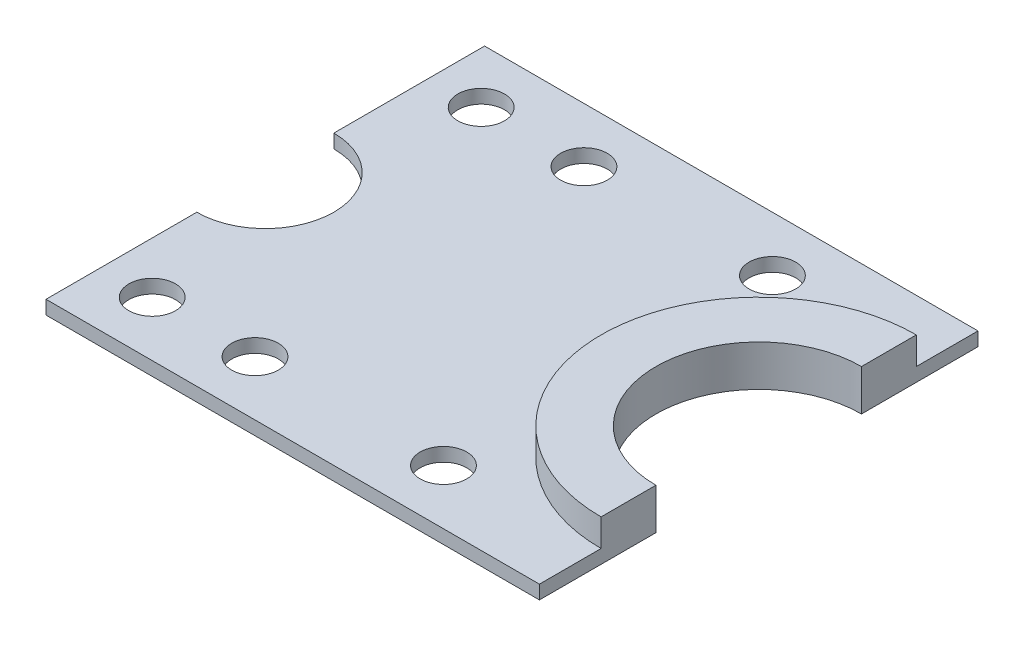
ISO-10303-21;
HEADER;
FILE_DESCRIPTION(('STEP AP214'),'2;1');
FILE_NAME('part.step','',(''),(''),'','','');
FILE_SCHEMA(('AUTOMOTIVE_DESIGN { 1 0 10303 214 1 1 1 1 }'));
ENDSEC;
DATA;
#1=APPLICATION_CONTEXT('core data for automotive mechanical design processes');
#2=APPLICATION_PROTOCOL_DEFINITION('international standard','automotive_design',2000,#1);
#3=PRODUCT_CONTEXT('',#1,'mechanical');
#4=PRODUCT('Part','Part','',(#3));
#5=PRODUCT_RELATED_PRODUCT_CATEGORY('part','',(#4));
#6=PRODUCT_DEFINITION_FORMATION('','',#4);
#7=PRODUCT_DEFINITION_CONTEXT('part definition',#1,'design');
#8=PRODUCT_DEFINITION('design','',#6,#7);
#9=PRODUCT_DEFINITION_SHAPE('','',#8);
#10=(LENGTH_UNIT() NAMED_UNIT(*) SI_UNIT(.MILLI.,.METRE.));
#11=(NAMED_UNIT(*) PLANE_ANGLE_UNIT() SI_UNIT($,.RADIAN.));
#12=(NAMED_UNIT(*) SI_UNIT($,.STERADIAN.) SOLID_ANGLE_UNIT());
#13=UNCERTAINTY_MEASURE_WITH_UNIT(LENGTH_MEASURE(1.E-05),#10,'distance_accuracy_value','');
#14=(GEOMETRIC_REPRESENTATION_CONTEXT(3) GLOBAL_UNCERTAINTY_ASSIGNED_CONTEXT((#13)) GLOBAL_UNIT_ASSIGNED_CONTEXT((#10,
#11,#12)) REPRESENTATION_CONTEXT('',''));
#15=CARTESIAN_POINT('',(0.,0.,0.));
#16=DIRECTION('',(0.,0.,1.));
#17=DIRECTION('',(1.,0.,0.));
#18=AXIS2_PLACEMENT_3D('',#15,#16,#17);
#19=CARTESIAN_POINT('',(0.,1.,0.));
#20=DIRECTION('',(1.,0.,0.));
#21=DIRECTION('',(0.,0.,-1.));
#22=AXIS2_PLACEMENT_3D('',#19,#20,#21);
#23=PLANE('',#22);
#24=DIRECTION('',(0.,0.,1.));
#25=VECTOR('',#24,1.);
#26=CARTESIAN_POINT('',(0.,0.,0.));
#27=LINE('',#26,#25);
#28=CARTESIAN_POINT('',(0.,0.,-32.));
#29=VERTEX_POINT('',#28);
#30=CARTESIAN_POINT('',(0.,0.,-21.));
#31=VERTEX_POINT('',#30);
#32=EDGE_CURVE('E207',#29,#31,#27,.T.);
#33=ORIENTED_EDGE('',*,*,#32,.T.);
#34=DIRECTION('',(0.,1.,0.));
#35=VECTOR('',#34,1.);
#36=CARTESIAN_POINT('',(0.,-21.2132034355964,-21.));
#37=LINE('',#36,#35);
#38=CARTESIAN_POINT('',(0.,1.,-21.));
#39=VERTEX_POINT('',#38);
#40=EDGE_CURVE('E125',#31,#39,#37,.T.);
#41=ORIENTED_EDGE('',*,*,#40,.T.);
#42=DIRECTION('',(0.,0.,1.));
#43=VECTOR('',#42,1.);
#44=CARTESIAN_POINT('',(0.,1.,0.));
#45=LINE('',#44,#43);
#46=CARTESIAN_POINT('',(0.,1.,-32.));
#47=VERTEX_POINT('',#46);
#48=EDGE_CURVE('E195',#47,#39,#45,.T.);
#49=ORIENTED_EDGE('',*,*,#48,.F.);
#50=DIRECTION('',(0.,-1.,0.));
#51=VECTOR('',#50,1.);
#52=CARTESIAN_POINT('',(0.,1.,-32.));
#53=LINE('',#52,#51);
#54=EDGE_CURVE('E206',#47,#29,#53,.T.);
#55=ORIENTED_EDGE('',*,*,#54,.T.);
#56=EDGE_LOOP('',(#33,#41,#49,#55));
#57=FACE_BOUND('',#56,.T.);
#58=ADVANCED_FACE('F43',(#57),#23,.F.);
#59=CARTESIAN_POINT('',(36.,1.,0.));
#60=DIRECTION('',(-1.,0.,0.));
#61=DIRECTION('',(0.,0.,1.));
#62=AXIS2_PLACEMENT_3D('',#59,#60,#61);
#63=PLANE('',#62);
#64=DIRECTION('',(0.,0.,-1.));
#65=VECTOR('',#64,1.);
#66=CARTESIAN_POINT('',(36.,0.,0.));
#67=LINE('',#66,#65);
#68=CARTESIAN_POINT('',(36.,0.,0.));
#69=VERTEX_POINT('',#68);
#70=CARTESIAN_POINT('',(36.,0.,-8.5));
#71=VERTEX_POINT('',#70);
#72=EDGE_CURVE('E213',#69,#71,#67,.T.);
#73=ORIENTED_EDGE('',*,*,#72,.T.);
#74=DIRECTION('',(0.,1.,0.));
#75=VECTOR('',#74,1.);
#76=CARTESIAN_POINT('',(36.,-21.2132034355964,-8.5));
#77=LINE('',#76,#75);
#78=CARTESIAN_POINT('',(36.,3.,-8.5));
#79=VERTEX_POINT('',#78);
#80=EDGE_CURVE('E66',#71,#79,#77,.T.);
#81=ORIENTED_EDGE('',*,*,#80,.T.);
#82=DIRECTION('',(0.,0.,-1.));
#83=VECTOR('',#82,1.);
#84=CARTESIAN_POINT('',(36.,3.,-8.5));
#85=LINE('',#84,#83);
#86=CARTESIAN_POINT('',(36.,3.,-4.5));
#87=VERTEX_POINT('',#86);
#88=EDGE_CURVE('E139',#87,#79,#85,.T.);
#89=ORIENTED_EDGE('',*,*,#88,.F.);
#90=DIRECTION('',(0.,-1.,0.));
#91=VECTOR('',#90,1.);
#92=CARTESIAN_POINT('',(36.,3.,-4.5));
#93=LINE('',#92,#91);
#94=CARTESIAN_POINT('',(36.,1.,-4.5));
#95=VERTEX_POINT('',#94);
#96=EDGE_CURVE('E144',#87,#95,#93,.T.);
#97=ORIENTED_EDGE('',*,*,#96,.T.);
#98=DIRECTION('',(0.,0.,-1.));
#99=VECTOR('',#98,1.);
#100=CARTESIAN_POINT('',(36.,1.,0.));
#101=LINE('',#100,#99);
#102=CARTESIAN_POINT('',(36.,1.,0.));
#103=VERTEX_POINT('',#102);
#104=EDGE_CURVE('E202',#103,#95,#101,.T.);
#105=ORIENTED_EDGE('',*,*,#104,.F.);
#106=DIRECTION('',(0.,-1.,0.));
#107=VECTOR('',#106,1.);
#108=CARTESIAN_POINT('',(36.,1.,0.));
#109=LINE('',#108,#107);
#110=EDGE_CURVE('E223',#103,#69,#109,.T.);
#111=ORIENTED_EDGE('',*,*,#110,.T.);
#112=EDGE_LOOP('',(#73,#81,#89,#97,#105,#111));
#113=FACE_BOUND('',#112,.T.);
#114=ADVANCED_FACE('F241',(#113),#63,.F.);
#115=CARTESIAN_POINT('',(0.,1.,-11.));
#116=VERTEX_POINT('',#115);
#117=CARTESIAN_POINT('',(0.,1.,0.));
#118=VERTEX_POINT('',#117);
#119=EDGE_CURVE('E199',#116,#118,#45,.T.);
#120=ORIENTED_EDGE('',*,*,#119,.F.);
#121=DIRECTION('',(0.,1.,0.));
#122=VECTOR('',#121,1.);
#123=CARTESIAN_POINT('',(0.,-21.2132034355964,-11.));
#124=LINE('',#123,#122);
#125=CARTESIAN_POINT('',(0.,0.,-11.));
#126=VERTEX_POINT('',#125);
#127=EDGE_CURVE('E188',#116,#126,#124,.F.);
#128=ORIENTED_EDGE('',*,*,#127,.T.);
#129=CARTESIAN_POINT('',(0.,0.,0.));
#130=VERTEX_POINT('',#129);
#131=EDGE_CURVE('E194',#126,#130,#27,.T.);
#132=ORIENTED_EDGE('',*,*,#131,.T.);
#133=DIRECTION('',(0.,-1.,0.));
#134=VECTOR('',#133,1.);
#135=CARTESIAN_POINT('',(0.,1.,0.));
#136=LINE('',#135,#134);
#137=EDGE_CURVE('E51',#118,#130,#136,.T.);
#138=ORIENTED_EDGE('',*,*,#137,.F.);
#139=EDGE_LOOP('',(#120,#128,#132,#138));
#140=FACE_BOUND('',#139,.T.);
#141=ADVANCED_FACE('F45',(#140),#23,.F.);
#142=CARTESIAN_POINT('',(0.,1.,0.));
#143=DIRECTION('',(0.,0.,-1.));
#144=DIRECTION('',(-1.,0.,0.));
#145=AXIS2_PLACEMENT_3D('',#142,#143,#144);
#146=PLANE('',#145);
#147=DIRECTION('',(1.,0.,0.));
#148=VECTOR('',#147,1.);
#149=CARTESIAN_POINT('',(0.,0.,0.));
#150=LINE('',#149,#148);
#151=EDGE_CURVE('E210',#130,#69,#150,.T.);
#152=ORIENTED_EDGE('',*,*,#151,.T.);
#153=ORIENTED_EDGE('',*,*,#110,.F.);
#154=DIRECTION('',(1.,0.,0.));
#155=VECTOR('',#154,1.);
#156=CARTESIAN_POINT('',(0.,1.,0.));
#157=LINE('',#156,#155);
#158=EDGE_CURVE('E198',#118,#103,#157,.T.);
#159=ORIENTED_EDGE('',*,*,#158,.F.);
#160=ORIENTED_EDGE('',*,*,#137,.T.);
#161=EDGE_LOOP('',(#152,#153,#159,#160));
#162=FACE_BOUND('',#161,.T.);
#163=ADVANCED_FACE('F229',(#162),#146,.F.);
#164=CARTESIAN_POINT('',(36.,1.,-27.5));
#165=VERTEX_POINT('',#164);
#166=CARTESIAN_POINT('',(36.,1.,-32.));
#167=VERTEX_POINT('',#166);
#168=EDGE_CURVE('E201',#165,#167,#101,.T.);
#169=ORIENTED_EDGE('',*,*,#168,.F.);
#170=DIRECTION('',(0.,-1.,0.));
#171=VECTOR('',#170,1.);
#172=CARTESIAN_POINT('',(36.,3.,-27.5));
#173=LINE('',#172,#171);
#174=CARTESIAN_POINT('',(36.,3.,-27.5));
#175=VERTEX_POINT('',#174);
#176=EDGE_CURVE('E131',#175,#165,#173,.T.);
#177=ORIENTED_EDGE('',*,*,#176,.F.);
#178=DIRECTION('',(0.,0.,-1.));
#179=VECTOR('',#178,1.);
#180=CARTESIAN_POINT('',(36.,3.,-23.5));
#181=LINE('',#180,#179);
#182=CARTESIAN_POINT('',(36.,3.,-23.5));
#183=VERTEX_POINT('',#182);
#184=EDGE_CURVE('E128',#183,#175,#181,.T.);
#185=ORIENTED_EDGE('',*,*,#184,.F.);
#186=DIRECTION('',(0.,1.,0.));
#187=VECTOR('',#186,1.);
#188=CARTESIAN_POINT('',(36.,-21.2132034355964,-23.5));
#189=LINE('',#188,#187);
#190=CARTESIAN_POINT('',(36.,0.,-23.5));
#191=VERTEX_POINT('',#190);
#192=EDGE_CURVE('E117',#183,#191,#189,.F.);
#193=ORIENTED_EDGE('',*,*,#192,.T.);
#194=CARTESIAN_POINT('',(36.,0.,-32.));
#195=VERTEX_POINT('',#194);
#196=EDGE_CURVE('E212',#191,#195,#67,.T.);
#197=ORIENTED_EDGE('',*,*,#196,.T.);
#198=DIRECTION('',(0.,-1.,0.));
#199=VECTOR('',#198,1.);
#200=CARTESIAN_POINT('',(36.,1.,-32.));
#201=LINE('',#200,#199);
#202=EDGE_CURVE('E220',#167,#195,#201,.T.);
#203=ORIENTED_EDGE('',*,*,#202,.F.);
#204=EDGE_LOOP('',(#169,#177,#185,#193,#197,#203));
#205=FACE_BOUND('',#204,.T.);
#206=ADVANCED_FACE('F129',(#205),#63,.F.);
#207=CARTESIAN_POINT('',(0.,1.,-32.));
#208=DIRECTION('',(0.,0.,1.));
#209=DIRECTION('',(1.,0.,0.));
#210=AXIS2_PLACEMENT_3D('',#207,#208,#209);
#211=PLANE('',#210);
#212=DIRECTION('',(-1.,0.,0.));
#213=VECTOR('',#212,1.);
#214=CARTESIAN_POINT('',(0.,0.,-32.));
#215=LINE('',#214,#213);
#216=EDGE_CURVE('E216',#195,#29,#215,.T.);
#217=ORIENTED_EDGE('',*,*,#216,.T.);
#218=ORIENTED_EDGE('',*,*,#54,.F.);
#219=DIRECTION('',(-1.,0.,0.));
#220=VECTOR('',#219,1.);
#221=CARTESIAN_POINT('',(0.,1.,-32.));
#222=LINE('',#221,#220);
#223=EDGE_CURVE('E204',#167,#47,#222,.T.);
#224=ORIENTED_EDGE('',*,*,#223,.F.);
#225=ORIENTED_EDGE('',*,*,#202,.T.);
#226=EDGE_LOOP('',(#217,#218,#224,#225));
#227=FACE_BOUND('',#226,.T.);
#228=ADVANCED_FACE('F276',(#227),#211,.F.);
#229=CARTESIAN_POINT('',(0.,1.,0.));
#230=DIRECTION('',(0.,-1.,0.));
#231=DIRECTION('',(0.,0.,-1.));
#232=AXIS2_PLACEMENT_3D('',#229,#230,#231);
#233=PLANE('',#232);
#234=CARTESIAN_POINT('',(36.,1.,-16.));
#235=DIRECTION('',(0.,1.,0.));
#236=DIRECTION('',(0.,0.,1.));
#237=AXIS2_PLACEMENT_3D('',#234,#235,#236);
#238=CIRCLE('',#237,11.5);
#239=EDGE_CURVE('E58',#165,#95,#238,.T.);
#240=ORIENTED_EDGE('',*,*,#239,.F.);
#241=ORIENTED_EDGE('',*,*,#168,.T.);
#242=ORIENTED_EDGE('',*,*,#223,.T.);
#243=ORIENTED_EDGE('',*,*,#48,.T.);
#244=CARTESIAN_POINT('',(0.,1.,-16.));
#245=DIRECTION('',(0.,1.,0.));
#246=DIRECTION('',(0.,0.,1.));
#247=AXIS2_PLACEMENT_3D('',#244,#245,#246);
#248=CIRCLE('',#247,5.);
#249=EDGE_CURVE('E149',#116,#39,#248,.T.);
#250=ORIENTED_EDGE('',*,*,#249,.F.);
#251=ORIENTED_EDGE('',*,*,#119,.T.);
#252=ORIENTED_EDGE('',*,*,#158,.T.);
#253=ORIENTED_EDGE('',*,*,#104,.T.);
#254=EDGE_LOOP('',(#240,#241,#242,#243,#250,#251,#252,#253));
#255=FACE_BOUND('',#254,.T.);
#256=CARTESIAN_POINT('',(11.25,1.,-28.));
#257=DIRECTION('',(0.,1.,0.));
#258=DIRECTION('',(0.,0.,1.));
#259=AXIS2_PLACEMENT_3D('',#256,#257,#258);
#260=CIRCLE('',#259,1.7);
#261=CARTESIAN_POINT('',(11.25,1.,-26.3));
#262=VERTEX_POINT('',#261);
#263=EDGE_CURVE('E167',#262,#262,#260,.T.);
#264=ORIENTED_EDGE('',*,*,#263,.F.);
#265=EDGE_LOOP('',(#264));
#266=FACE_BOUND('',#265,.T.);
#267=CARTESIAN_POINT('',(25.,1.,-28.));
#268=DIRECTION('',(0.,1.,0.));
#269=DIRECTION('',(0.,0.,1.));
#270=AXIS2_PLACEMENT_3D('',#267,#268,#269);
#271=CIRCLE('',#270,1.7);
#272=CARTESIAN_POINT('',(25.,1.,-26.3));
#273=VERTEX_POINT('',#272);
#274=EDGE_CURVE('E168',#273,#273,#271,.T.);
#275=ORIENTED_EDGE('',*,*,#274,.F.);
#276=EDGE_LOOP('',(#275));
#277=FACE_BOUND('',#276,.T.);
#278=CARTESIAN_POINT('',(25.,1.,-4.));
#279=DIRECTION('',(0.,1.,0.));
#280=DIRECTION('',(0.,0.,-1.));
#281=AXIS2_PLACEMENT_3D('',#278,#279,#280);
#282=CIRCLE('',#281,1.7);
#283=CARTESIAN_POINT('',(25.,1.,-5.7));
#284=VERTEX_POINT('',#283);
#285=EDGE_CURVE('E178',#284,#284,#282,.T.);
#286=ORIENTED_EDGE('',*,*,#285,.F.);
#287=EDGE_LOOP('',(#286));
#288=FACE_BOUND('',#287,.T.);
#289=CARTESIAN_POINT('',(11.25,1.,-4.));
#290=DIRECTION('',(0.,1.,0.));
#291=DIRECTION('',(0.,0.,-1.));
#292=AXIS2_PLACEMENT_3D('',#289,#290,#291);
#293=CIRCLE('',#292,1.7);
#294=CARTESIAN_POINT('',(11.25,1.,-5.7));
#295=VERTEX_POINT('',#294);
#296=EDGE_CURVE('E153',#295,#295,#293,.T.);
#297=ORIENTED_EDGE('',*,*,#296,.F.);
#298=EDGE_LOOP('',(#297));
#299=FACE_BOUND('',#298,.T.);
#300=CARTESIAN_POINT('',(3.75,1.,-4.));
#301=DIRECTION('',(0.,1.,0.));
#302=DIRECTION('',(0.,0.,-1.));
#303=AXIS2_PLACEMENT_3D('',#300,#301,#302);
#304=CIRCLE('',#303,1.7);
#305=CARTESIAN_POINT('',(3.75,1.,-5.7));
#306=VERTEX_POINT('',#305);
#307=EDGE_CURVE('E154',#306,#306,#304,.T.);
#308=ORIENTED_EDGE('',*,*,#307,.F.);
#309=EDGE_LOOP('',(#308));
#310=FACE_BOUND('',#309,.T.);
#311=CARTESIAN_POINT('',(3.75,1.,-28.));
#312=DIRECTION('',(0.,1.,0.));
#313=DIRECTION('',(0.,0.,1.));
#314=AXIS2_PLACEMENT_3D('',#311,#312,#313);
#315=CIRCLE('',#314,1.7);
#316=CARTESIAN_POINT('',(3.75,1.,-26.3));
#317=VERTEX_POINT('',#316);
#318=EDGE_CURVE('E171',#317,#317,#315,.T.);
#319=ORIENTED_EDGE('',*,*,#318,.F.);
#320=EDGE_LOOP('',(#319));
#321=FACE_BOUND('',#320,.T.);
#322=ADVANCED_FACE('F244',(#255,#266,#277,#288,#299,#310,#321),#233,.F.);
#323=CARTESIAN_POINT('',(0.,0.,0.));
#324=DIRECTION('',(0.,-1.,0.));
#325=DIRECTION('',(0.,0.,-1.));
#326=AXIS2_PLACEMENT_3D('',#323,#324,#325);
#327=PLANE('',#326);
#328=CARTESIAN_POINT('',(11.25,0.,-28.));
#329=DIRECTION('',(0.,-1.,0.));
#330=DIRECTION('',(0.,0.,-1.));
#331=AXIS2_PLACEMENT_3D('',#328,#329,#330);
#332=CIRCLE('',#331,1.7);
#333=CARTESIAN_POINT('',(11.25,0.,-29.7));
#334=VERTEX_POINT('',#333);
#335=EDGE_CURVE('E164',#334,#334,#332,.F.);
#336=ORIENTED_EDGE('',*,*,#335,.T.);
#337=EDGE_LOOP('',(#336));
#338=FACE_BOUND('',#337,.T.);
#339=CARTESIAN_POINT('',(25.,0.,-28.));
#340=DIRECTION('',(0.,-1.,0.));
#341=DIRECTION('',(0.,0.,-1.));
#342=AXIS2_PLACEMENT_3D('',#339,#340,#341);
#343=CIRCLE('',#342,1.7);
#344=CARTESIAN_POINT('',(25.,0.,-29.7));
#345=VERTEX_POINT('',#344);
#346=EDGE_CURVE('E172',#345,#345,#343,.F.);
#347=ORIENTED_EDGE('',*,*,#346,.T.);
#348=EDGE_LOOP('',(#347));
#349=FACE_BOUND('',#348,.T.);
#350=CARTESIAN_POINT('',(36.,0.,-16.));
#351=DIRECTION('',(0.,-1.,0.));
#352=DIRECTION('',(0.,0.,-1.));
#353=AXIS2_PLACEMENT_3D('',#350,#351,#352);
#354=CIRCLE('',#353,7.5);
#355=EDGE_CURVE('E122',#191,#71,#354,.F.);
#356=ORIENTED_EDGE('',*,*,#355,.T.);
#357=ORIENTED_EDGE('',*,*,#72,.F.);
#358=ORIENTED_EDGE('',*,*,#151,.F.);
#359=ORIENTED_EDGE('',*,*,#131,.F.);
#360=CARTESIAN_POINT('',(0.,0.,-16.));
#361=DIRECTION('',(0.,-1.,0.));
#362=DIRECTION('',(0.,0.,-1.));
#363=AXIS2_PLACEMENT_3D('',#360,#361,#362);
#364=CIRCLE('',#363,5.);
#365=EDGE_CURVE('E11',#31,#126,#364,.T.);
#366=ORIENTED_EDGE('',*,*,#365,.F.);
#367=ORIENTED_EDGE('',*,*,#32,.F.);
#368=ORIENTED_EDGE('',*,*,#216,.F.);
#369=ORIENTED_EDGE('',*,*,#196,.F.);
#370=EDGE_LOOP('',(#356,#357,#358,#359,#366,#367,#368,#369));
#371=FACE_BOUND('',#370,.T.);
#372=CARTESIAN_POINT('',(25.,0.,-4.));
#373=DIRECTION('',(0.,-1.,0.));
#374=DIRECTION('',(0.,0.,-1.));
#375=AXIS2_PLACEMENT_3D('',#372,#373,#374);
#376=CIRCLE('',#375,1.7);
#377=CARTESIAN_POINT('',(25.,0.,-5.7));
#378=VERTEX_POINT('',#377);
#379=EDGE_CURVE('E157',#378,#378,#376,.F.);
#380=ORIENTED_EDGE('',*,*,#379,.T.);
#381=EDGE_LOOP('',(#380));
#382=FACE_BOUND('',#381,.T.);
#383=CARTESIAN_POINT('',(11.25,0.,-4.));
#384=DIRECTION('',(0.,-1.,0.));
#385=DIRECTION('',(0.,0.,-1.));
#386=AXIS2_PLACEMENT_3D('',#383,#384,#385);
#387=CIRCLE('',#386,1.7);
#388=CARTESIAN_POINT('',(11.25,0.,-5.7));
#389=VERTEX_POINT('',#388);
#390=EDGE_CURVE('E150',#389,#389,#387,.F.);
#391=ORIENTED_EDGE('',*,*,#390,.T.);
#392=EDGE_LOOP('',(#391));
#393=FACE_BOUND('',#392,.T.);
#394=CARTESIAN_POINT('',(3.75,0.,-4.));
#395=DIRECTION('',(0.,-1.,0.));
#396=DIRECTION('',(0.,0.,-1.));
#397=AXIS2_PLACEMENT_3D('',#394,#395,#396);
#398=CIRCLE('',#397,1.7);
#399=CARTESIAN_POINT('',(3.75,0.,-5.7));
#400=VERTEX_POINT('',#399);
#401=EDGE_CURVE('E158',#400,#400,#398,.F.);
#402=ORIENTED_EDGE('',*,*,#401,.T.);
#403=EDGE_LOOP('',(#402));
#404=FACE_BOUND('',#403,.T.);
#405=CARTESIAN_POINT('',(3.75,0.,-28.));
#406=DIRECTION('',(0.,-1.,0.));
#407=DIRECTION('',(0.,0.,-1.));
#408=AXIS2_PLACEMENT_3D('',#405,#406,#407);
#409=CIRCLE('',#408,1.7);
#410=CARTESIAN_POINT('',(3.75,0.,-29.7));
#411=VERTEX_POINT('',#410);
#412=EDGE_CURVE('E185',#411,#411,#409,.F.);
#413=ORIENTED_EDGE('',*,*,#412,.T.);
#414=EDGE_LOOP('',(#413));
#415=FACE_BOUND('',#414,.T.);
#416=ADVANCED_FACE('F238',(#338,#349,#371,#382,#393,#404,#415),#327,.T.);
#417=CARTESIAN_POINT('',(3.75,-21.2132034355964,-28.));
#418=DIRECTION('',(0.,1.,0.));
#419=DIRECTION('',(0.,0.,1.));
#420=AXIS2_PLACEMENT_3D('',#417,#418,#419);
#421=CYLINDRICAL_SURFACE('',#420,1.7);
#422=ORIENTED_EDGE('',*,*,#318,.T.);
#423=EDGE_LOOP('',(#422));
#424=FACE_BOUND('',#423,.T.);
#425=ORIENTED_EDGE('',*,*,#412,.F.);
#426=EDGE_LOOP('',(#425));
#427=FACE_BOUND('',#426,.T.);
#428=ADVANCED_FACE('F281',(#424,#427),#421,.F.);
#429=CARTESIAN_POINT('',(0.,-21.2132034355964,-16.));
#430=DIRECTION('',(0.,1.,0.));
#431=DIRECTION('',(0.,0.,1.));
#432=AXIS2_PLACEMENT_3D('',#429,#430,#431);
#433=CYLINDRICAL_SURFACE('',#432,5.);
#434=ORIENTED_EDGE('',*,*,#365,.T.);
#435=ORIENTED_EDGE('',*,*,#127,.F.);
#436=ORIENTED_EDGE('',*,*,#249,.T.);
#437=ORIENTED_EDGE('',*,*,#40,.F.);
#438=EDGE_LOOP('',(#434,#435,#436,#437));
#439=FACE_BOUND('',#438,.T.);
#440=ADVANCED_FACE('F287',(#439),#433,.F.);
#441=CARTESIAN_POINT('',(3.75,-21.2132034355964,-4.));
#442=DIRECTION('',(0.,1.,0.));
#443=DIRECTION('',(0.,0.,1.));
#444=AXIS2_PLACEMENT_3D('',#441,#442,#443);
#445=CYLINDRICAL_SURFACE('',#444,1.7);
#446=ORIENTED_EDGE('',*,*,#307,.T.);
#447=EDGE_LOOP('',(#446));
#448=FACE_BOUND('',#447,.T.);
#449=ORIENTED_EDGE('',*,*,#401,.F.);
#450=EDGE_LOOP('',(#449));
#451=FACE_BOUND('',#450,.T.);
#452=ADVANCED_FACE('F300',(#448,#451),#445,.F.);
#453=CARTESIAN_POINT('',(11.25,-21.2132034355964,-4.));
#454=DIRECTION('',(0.,1.,0.));
#455=DIRECTION('',(0.,0.,1.));
#456=AXIS2_PLACEMENT_3D('',#453,#454,#455);
#457=CYLINDRICAL_SURFACE('',#456,1.7);
#458=ORIENTED_EDGE('',*,*,#296,.T.);
#459=EDGE_LOOP('',(#458));
#460=FACE_BOUND('',#459,.T.);
#461=ORIENTED_EDGE('',*,*,#390,.F.);
#462=EDGE_LOOP('',(#461));
#463=FACE_BOUND('',#462,.T.);
#464=ADVANCED_FACE('F292',(#460,#463),#457,.F.);
#465=CARTESIAN_POINT('',(25.,-21.2132034355964,-4.));
#466=DIRECTION('',(0.,1.,0.));
#467=DIRECTION('',(0.,0.,1.));
#468=AXIS2_PLACEMENT_3D('',#465,#466,#467);
#469=CYLINDRICAL_SURFACE('',#468,1.7);
#470=ORIENTED_EDGE('',*,*,#285,.T.);
#471=EDGE_LOOP('',(#470));
#472=FACE_BOUND('',#471,.T.);
#473=ORIENTED_EDGE('',*,*,#379,.F.);
#474=EDGE_LOOP('',(#473));
#475=FACE_BOUND('',#474,.T.);
#476=ADVANCED_FACE('F289',(#472,#475),#469,.F.);
#477=CARTESIAN_POINT('',(36.,-21.2132034355964,-16.));
#478=DIRECTION('',(0.,1.,0.));
#479=DIRECTION('',(0.,0.,1.));
#480=AXIS2_PLACEMENT_3D('',#477,#478,#479);
#481=CYLINDRICAL_SURFACE('',#480,7.5);
#482=ORIENTED_EDGE('',*,*,#355,.F.);
#483=ORIENTED_EDGE('',*,*,#192,.F.);
#484=CARTESIAN_POINT('',(36.,3.,-16.));
#485=DIRECTION('',(0.,-1.,0.));
#486=DIRECTION('',(0.,0.,1.));
#487=AXIS2_PLACEMENT_3D('',#484,#485,#486);
#488=CIRCLE('',#487,7.5);
#489=EDGE_CURVE('E121',#79,#183,#488,.T.);
#490=ORIENTED_EDGE('',*,*,#489,.F.);
#491=ORIENTED_EDGE('',*,*,#80,.F.);
#492=EDGE_LOOP('',(#482,#483,#490,#491));
#493=FACE_BOUND('',#492,.T.);
#494=ADVANCED_FACE('F119',(#493),#481,.F.);
#495=CARTESIAN_POINT('',(25.,-21.2132034355964,-28.));
#496=DIRECTION('',(0.,1.,0.));
#497=DIRECTION('',(0.,0.,1.));
#498=AXIS2_PLACEMENT_3D('',#495,#496,#497);
#499=CYLINDRICAL_SURFACE('',#498,1.7);
#500=ORIENTED_EDGE('',*,*,#274,.T.);
#501=EDGE_LOOP('',(#500));
#502=FACE_BOUND('',#501,.T.);
#503=ORIENTED_EDGE('',*,*,#346,.F.);
#504=EDGE_LOOP('',(#503));
#505=FACE_BOUND('',#504,.T.);
#506=ADVANCED_FACE('F257',(#502,#505),#499,.F.);
#507=CARTESIAN_POINT('',(11.25,-21.2132034355964,-28.));
#508=DIRECTION('',(0.,1.,0.));
#509=DIRECTION('',(0.,0.,1.));
#510=AXIS2_PLACEMENT_3D('',#507,#508,#509);
#511=CYLINDRICAL_SURFACE('',#510,1.7);
#512=ORIENTED_EDGE('',*,*,#263,.T.);
#513=EDGE_LOOP('',(#512));
#514=FACE_BOUND('',#513,.T.);
#515=ORIENTED_EDGE('',*,*,#335,.F.);
#516=EDGE_LOOP('',(#515));
#517=FACE_BOUND('',#516,.T.);
#518=ADVANCED_FACE('F249',(#514,#517),#511,.F.);
#519=CARTESIAN_POINT('',(36.,3.,-16.));
#520=DIRECTION('',(0.,-1.,0.));
#521=DIRECTION('',(0.,0.,-1.));
#522=AXIS2_PLACEMENT_3D('',#519,#520,#521);
#523=CYLINDRICAL_SURFACE('',#522,11.5);
#524=ORIENTED_EDGE('',*,*,#239,.T.);
#525=ORIENTED_EDGE('',*,*,#96,.F.);
#526=CARTESIAN_POINT('',(36.,3.,-16.));
#527=DIRECTION('',(0.,1.,0.));
#528=DIRECTION('',(0.,0.,1.));
#529=AXIS2_PLACEMENT_3D('',#526,#527,#528);
#530=CIRCLE('',#529,11.5);
#531=EDGE_CURVE('E134',#175,#87,#530,.T.);
#532=ORIENTED_EDGE('',*,*,#531,.F.);
#533=ORIENTED_EDGE('',*,*,#176,.T.);
#534=EDGE_LOOP('',(#524,#525,#532,#533));
#535=FACE_BOUND('',#534,.T.);
#536=ADVANCED_FACE('F247',(#535),#523,.T.);
#537=CARTESIAN_POINT('',(36.,3.,-16.));
#538=DIRECTION('',(0.,1.,0.));
#539=DIRECTION('',(0.,0.,1.));
#540=AXIS2_PLACEMENT_3D('',#537,#538,#539);
#541=PLANE('',#540);
#542=ORIENTED_EDGE('',*,*,#489,.T.);
#543=ORIENTED_EDGE('',*,*,#184,.T.);
#544=ORIENTED_EDGE('',*,*,#531,.T.);
#545=ORIENTED_EDGE('',*,*,#88,.T.);
#546=EDGE_LOOP('',(#542,#543,#544,#545));
#547=FACE_BOUND('',#546,.T.);
#548=ADVANCED_FACE('F137',(#547),#541,.T.);
#549=CLOSED_SHELL('',(#58,#114,#141,#163,#206,#228,#322,#416,#428,#440,#452,#464,#476,#494,#506,
#518,#536,#548));
#550=MANIFOLD_SOLID_BREP('B2',#549);
#551=ADVANCED_BREP_SHAPE_REPRESENTATION('',(#18,#550),#14);
#552=SHAPE_DEFINITION_REPRESENTATION(#9,#551);
ENDSEC;
END-ISO-10303-21;
